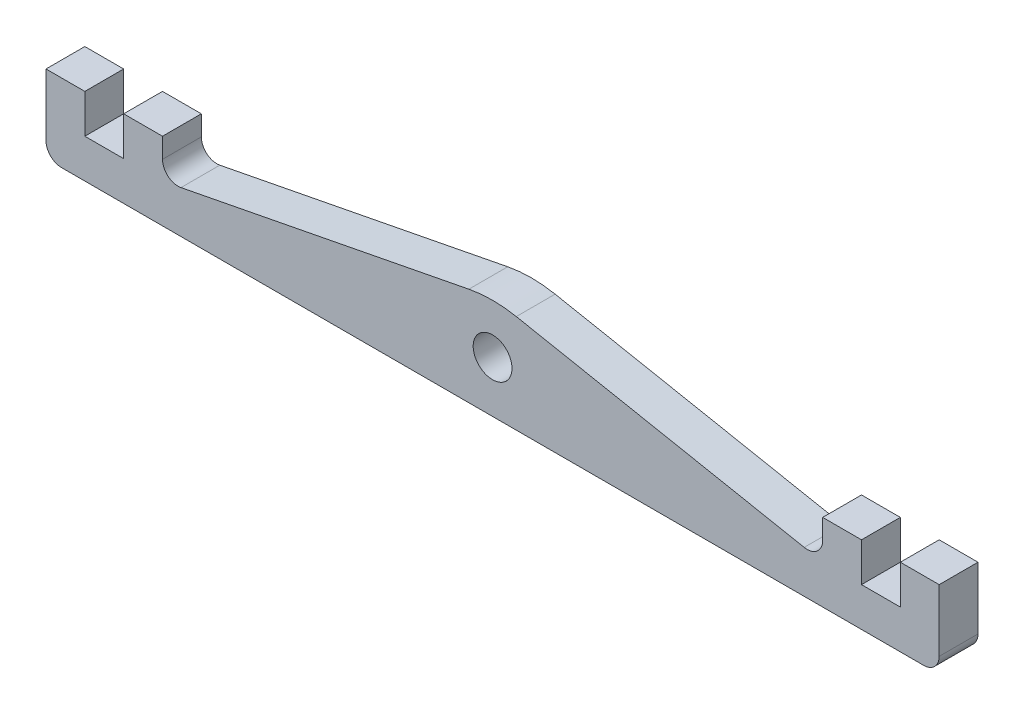
ISO-10303-21;
HEADER;
FILE_DESCRIPTION(('STEP AP214'),'2;1');
FILE_NAME('part.step','',(''),(''),'','','');
FILE_SCHEMA(('AUTOMOTIVE_DESIGN { 1 0 10303 214 1 1 1 1 }'));
ENDSEC;
DATA;
#1=APPLICATION_CONTEXT('core data for automotive mechanical design processes');
#2=APPLICATION_PROTOCOL_DEFINITION('international standard','automotive_design',2000,#1);
#3=PRODUCT_CONTEXT('',#1,'mechanical');
#4=PRODUCT('Part','Part','',(#3));
#5=PRODUCT_RELATED_PRODUCT_CATEGORY('part','',(#4));
#6=PRODUCT_DEFINITION_FORMATION('','',#4);
#7=PRODUCT_DEFINITION_CONTEXT('part definition',#1,'design');
#8=PRODUCT_DEFINITION('design','',#6,#7);
#9=PRODUCT_DEFINITION_SHAPE('','',#8);
#10=(LENGTH_UNIT() NAMED_UNIT(*) SI_UNIT(.MILLI.,.METRE.));
#11=(NAMED_UNIT(*) PLANE_ANGLE_UNIT() SI_UNIT($,.RADIAN.));
#12=(NAMED_UNIT(*) SI_UNIT($,.STERADIAN.) SOLID_ANGLE_UNIT());
#13=UNCERTAINTY_MEASURE_WITH_UNIT(LENGTH_MEASURE(1.E-05),#10,'distance_accuracy_value','');
#14=(GEOMETRIC_REPRESENTATION_CONTEXT(3) GLOBAL_UNCERTAINTY_ASSIGNED_CONTEXT((#13)) GLOBAL_UNIT_ASSIGNED_CONTEXT((#10,
#11,#12)) REPRESENTATION_CONTEXT('',''));
#15=CARTESIAN_POINT('',(0.,0.,0.));
#16=DIRECTION('',(0.,0.,1.));
#17=DIRECTION('',(1.,0.,0.));
#18=AXIS2_PLACEMENT_3D('',#15,#16,#17);
#19=CARTESIAN_POINT('',(70.485,5.08,6.35));
#20=DIRECTION('',(0.,0.,1.));
#21=DIRECTION('',(1.,0.,0.));
#22=AXIS2_PLACEMENT_3D('',#19,#20,#21);
#23=PLANE('',#22);
#24=CARTESIAN_POINT('',(70.485,5.08,6.35));
#25=DIRECTION('',(0.,0.,1.));
#26=DIRECTION('',(1.,0.,0.));
#27=AXIS2_PLACEMENT_3D('',#24,#25,#26);
#28=CIRCLE('',#27,2.54);
#29=CARTESIAN_POINT('',(70.485,2.54,6.35));
#30=VERTEX_POINT('',#29);
#31=CARTESIAN_POINT('',(73.025,5.08,6.35));
#32=VERTEX_POINT('',#31);
#33=EDGE_CURVE('E255',#30,#32,#28,.T.);
#34=ORIENTED_EDGE('',*,*,#33,.T.);
#35=DIRECTION('',(0.,1.,0.));
#36=VECTOR('',#35,1.);
#37=CARTESIAN_POINT('',(73.025,15.24,6.35));
#38=LINE('',#37,#36);
#39=CARTESIAN_POINT('',(73.025,15.24,6.35));
#40=VERTEX_POINT('',#39);
#41=EDGE_CURVE('E133',#32,#40,#38,.T.);
#42=ORIENTED_EDGE('',*,*,#41,.T.);
#43=DIRECTION('',(-1.,0.,0.));
#44=VECTOR('',#43,1.);
#45=CARTESIAN_POINT('',(66.675,15.24,6.35));
#46=LINE('',#45,#44);
#47=CARTESIAN_POINT('',(66.675,15.24,6.35));
#48=VERTEX_POINT('',#47);
#49=EDGE_CURVE('E312',#40,#48,#46,.T.);
#50=ORIENTED_EDGE('',*,*,#49,.T.);
#51=DIRECTION('',(0.,-1.,0.));
#52=VECTOR('',#51,1.);
#53=CARTESIAN_POINT('',(66.675,8.89,6.35));
#54=LINE('',#53,#52);
#55=CARTESIAN_POINT('',(66.675,8.89,6.35));
#56=VERTEX_POINT('',#55);
#57=EDGE_CURVE('E331',#48,#56,#54,.T.);
#58=ORIENTED_EDGE('',*,*,#57,.T.);
#59=DIRECTION('',(-1.,0.,0.));
#60=VECTOR('',#59,1.);
#61=CARTESIAN_POINT('',(60.325,8.89,6.35));
#62=LINE('',#61,#60);
#63=CARTESIAN_POINT('',(60.325,8.89,6.35));
#64=VERTEX_POINT('',#63);
#65=EDGE_CURVE('E328',#56,#64,#62,.T.);
#66=ORIENTED_EDGE('',*,*,#65,.T.);
#67=DIRECTION('',(0.,1.,0.));
#68=VECTOR('',#67,1.);
#69=CARTESIAN_POINT('',(60.325,15.24,6.35));
#70=LINE('',#69,#68);
#71=CARTESIAN_POINT('',(60.325,15.24,6.35));
#72=VERTEX_POINT('',#71);
#73=EDGE_CURVE('E330',#64,#72,#70,.T.);
#74=ORIENTED_EDGE('',*,*,#73,.T.);
#75=DIRECTION('',(-1.,0.,0.));
#76=VECTOR('',#75,1.);
#77=CARTESIAN_POINT('',(53.975,15.24,6.35));
#78=LINE('',#77,#76);
#79=CARTESIAN_POINT('',(53.975,15.24,6.35));
#80=VERTEX_POINT('',#79);
#81=EDGE_CURVE('E333',#72,#80,#78,.T.);
#82=ORIENTED_EDGE('',*,*,#81,.T.);
#83=DIRECTION('',(0.,-1.,0.));
#84=VECTOR('',#83,1.);
#85=CARTESIAN_POINT('',(53.975,11.971266390396,6.35));
#86=LINE('',#85,#84);
#87=CARTESIAN_POINT('',(53.975,11.971266390396,6.35));
#88=VERTEX_POINT('',#87);
#89=EDGE_CURVE('E339',#80,#88,#86,.T.);
#90=ORIENTED_EDGE('',*,*,#89,.T.);
#91=CARTESIAN_POINT('',(51.435,11.971266390396,6.35));
#92=DIRECTION('',(0.,0.,-1.));
#93=DIRECTION('',(1.,0.,0.));
#94=AXIS2_PLACEMENT_3D('',#91,#92,#93);
#95=CIRCLE('',#94,2.54);
#96=CARTESIAN_POINT('',(50.9503451517436,9.47793334443896,6.35));
#97=VERTEX_POINT('',#96);
#98=EDGE_CURVE('E341',#88,#97,#95,.T.);
#99=ORIENTED_EDGE('',*,*,#98,.T.);
#100=DIRECTION('',(-0.981627183447665,0.190808995376539,0.));
#101=VECTOR('',#100,1.);
#102=CARTESIAN_POINT('',(3.87723878605126,18.6280183118746,6.35));
#103=LINE('',#102,#101);
#104=CARTESIAN_POINT('',(3.87723878605126,18.6280183118746,6.35));
#105=VERTEX_POINT('',#104);
#106=EDGE_CURVE('E343',#97,#105,#103,.T.);
#107=ORIENTED_EDGE('',*,*,#106,.T.);
#108=CARTESIAN_POINT('',(0.,-1.31864605578194,6.35));
#109=DIRECTION('',(0.,0.,1.));
#110=DIRECTION('',(1.,0.,0.));
#111=AXIS2_PLACEMENT_3D('',#108,#109,#110);
#112=CIRCLE('',#111,20.32);
#113=CARTESIAN_POINT('',(-3.87723878605126,18.6280183118746,6.35));
#114=VERTEX_POINT('',#113);
#115=EDGE_CURVE('E345',#105,#114,#112,.T.);
#116=ORIENTED_EDGE('',*,*,#115,.T.);
#117=DIRECTION('',(-0.981627183447665,-0.190808995376539,0.));
#118=VECTOR('',#117,1.);
#119=CARTESIAN_POINT('',(-3.87723878605126,18.6280183118746,6.35));
#120=LINE('',#119,#118);
#121=CARTESIAN_POINT('',(-50.9503451517436,9.47793334443896,6.35));
#122=VERTEX_POINT('',#121);
#123=EDGE_CURVE('E347',#114,#122,#120,.T.);
#124=ORIENTED_EDGE('',*,*,#123,.T.);
#125=CARTESIAN_POINT('',(-51.435,11.971266390396,6.35));
#126=DIRECTION('',(0.,0.,-1.));
#127=DIRECTION('',(-1.,0.,0.));
#128=AXIS2_PLACEMENT_3D('',#125,#126,#127);
#129=CIRCLE('',#128,2.54);
#130=CARTESIAN_POINT('',(-53.975,11.971266390396,6.35));
#131=VERTEX_POINT('',#130);
#132=EDGE_CURVE('E349',#122,#131,#129,.T.);
#133=ORIENTED_EDGE('',*,*,#132,.T.);
#134=DIRECTION('',(0.,1.,0.));
#135=VECTOR('',#134,1.);
#136=CARTESIAN_POINT('',(-53.975,11.971266390396,6.35));
#137=LINE('',#136,#135);
#138=CARTESIAN_POINT('',(-53.975,15.24,6.35));
#139=VERTEX_POINT('',#138);
#140=EDGE_CURVE('E351',#131,#139,#137,.T.);
#141=ORIENTED_EDGE('',*,*,#140,.T.);
#142=DIRECTION('',(-1.,0.,0.));
#143=VECTOR('',#142,1.);
#144=CARTESIAN_POINT('',(-53.975,15.24,6.35));
#145=LINE('',#144,#143);
#146=CARTESIAN_POINT('',(-60.325,15.24,6.35));
#147=VERTEX_POINT('',#146);
#148=EDGE_CURVE('E353',#139,#147,#145,.T.);
#149=ORIENTED_EDGE('',*,*,#148,.T.);
#150=DIRECTION('',(0.,-1.,0.));
#151=VECTOR('',#150,1.);
#152=CARTESIAN_POINT('',(-60.325,15.24,6.35));
#153=LINE('',#152,#151);
#154=CARTESIAN_POINT('',(-60.325,8.89,6.35));
#155=VERTEX_POINT('',#154);
#156=EDGE_CURVE('E355',#147,#155,#153,.T.);
#157=ORIENTED_EDGE('',*,*,#156,.T.);
#158=DIRECTION('',(-1.,0.,0.));
#159=VECTOR('',#158,1.);
#160=CARTESIAN_POINT('',(-60.325,8.89,6.35));
#161=LINE('',#160,#159);
#162=CARTESIAN_POINT('',(-66.675,8.89,6.35));
#163=VERTEX_POINT('',#162);
#164=EDGE_CURVE('E357',#155,#163,#161,.T.);
#165=ORIENTED_EDGE('',*,*,#164,.T.);
#166=DIRECTION('',(0.,1.,0.));
#167=VECTOR('',#166,1.);
#168=CARTESIAN_POINT('',(-66.675,8.89,6.35));
#169=LINE('',#168,#167);
#170=CARTESIAN_POINT('',(-66.675,15.24,6.35));
#171=VERTEX_POINT('',#170);
#172=EDGE_CURVE('E359',#163,#171,#169,.T.);
#173=ORIENTED_EDGE('',*,*,#172,.T.);
#174=DIRECTION('',(-1.,0.,0.));
#175=VECTOR('',#174,1.);
#176=CARTESIAN_POINT('',(-66.675,15.24,6.35));
#177=LINE('',#176,#175);
#178=CARTESIAN_POINT('',(-73.025,15.24,6.35));
#179=VERTEX_POINT('',#178);
#180=EDGE_CURVE('E194',#171,#179,#177,.T.);
#181=ORIENTED_EDGE('',*,*,#180,.T.);
#182=DIRECTION('',(0.,-1.,0.));
#183=VECTOR('',#182,1.);
#184=CARTESIAN_POINT('',(-73.025,15.24,6.35));
#185=LINE('',#184,#183);
#186=CARTESIAN_POINT('',(-73.025,5.08,6.35));
#187=VERTEX_POINT('',#186);
#188=EDGE_CURVE('E188',#179,#187,#185,.T.);
#189=ORIENTED_EDGE('',*,*,#188,.T.);
#190=CARTESIAN_POINT('',(-70.485,5.08,6.35));
#191=DIRECTION('',(0.,0.,1.));
#192=DIRECTION('',(-1.,0.,0.));
#193=AXIS2_PLACEMENT_3D('',#190,#191,#192);
#194=CIRCLE('',#193,2.54);
#195=CARTESIAN_POINT('',(-70.485,2.54,6.35));
#196=VERTEX_POINT('',#195);
#197=EDGE_CURVE('E192',#187,#196,#194,.T.);
#198=ORIENTED_EDGE('',*,*,#197,.T.);
#199=DIRECTION('',(1.,0.,0.));
#200=VECTOR('',#199,1.);
#201=CARTESIAN_POINT('',(-70.485,2.54,6.35));
#202=LINE('',#201,#200);
#203=EDGE_CURVE('E48',#196,#30,#202,.T.);
#204=ORIENTED_EDGE('',*,*,#203,.T.);
#205=EDGE_LOOP('',(#34,#42,#50,#58,#66,#74,#82,#90,#99,#107,#116,#124,#133,#141,#149,#157,#165,
#173,#181,#189,#198,#204));
#206=FACE_BOUND('',#205,.T.);
#207=CARTESIAN_POINT('',(0.,10.922,6.35));
#208=DIRECTION('',(0.,0.,1.));
#209=DIRECTION('',(1.,0.,0.));
#210=AXIS2_PLACEMENT_3D('',#207,#208,#209);
#211=CIRCLE('',#210,3.175);
#212=CARTESIAN_POINT('',(3.175,10.922,6.35));
#213=VERTEX_POINT('',#212);
#214=EDGE_CURVE('E216',#213,#213,#211,.T.);
#215=ORIENTED_EDGE('',*,*,#214,.F.);
#216=EDGE_LOOP('',(#215));
#217=FACE_BOUND('',#216,.T.);
#218=ADVANCED_FACE('F31',(#206,#217),#23,.T.);
#219=CARTESIAN_POINT('',(70.485,5.08,0.));
#220=DIRECTION('',(0.,0.,1.));
#221=DIRECTION('',(1.,0.,0.));
#222=AXIS2_PLACEMENT_3D('',#219,#220,#221);
#223=PLANE('',#222);
#224=CARTESIAN_POINT('',(70.485,5.08,0.));
#225=DIRECTION('',(0.,0.,1.));
#226=DIRECTION('',(1.,0.,0.));
#227=AXIS2_PLACEMENT_3D('',#224,#225,#226);
#228=CIRCLE('',#227,2.54);
#229=CARTESIAN_POINT('',(70.485,2.54,0.));
#230=VERTEX_POINT('',#229);
#231=CARTESIAN_POINT('',(73.025,5.08,0.));
#232=VERTEX_POINT('',#231);
#233=EDGE_CURVE('E212',#230,#232,#228,.T.);
#234=ORIENTED_EDGE('',*,*,#233,.F.);
#235=DIRECTION('',(1.,0.,0.));
#236=VECTOR('',#235,1.);
#237=CARTESIAN_POINT('',(-70.485,2.54,0.));
#238=LINE('',#237,#236);
#239=CARTESIAN_POINT('',(-70.485,2.54,0.));
#240=VERTEX_POINT('',#239);
#241=EDGE_CURVE('E125',#240,#230,#238,.T.);
#242=ORIENTED_EDGE('',*,*,#241,.F.);
#243=CARTESIAN_POINT('',(-70.485,5.08,0.));
#244=DIRECTION('',(0.,0.,1.));
#245=DIRECTION('',(-1.,0.,0.));
#246=AXIS2_PLACEMENT_3D('',#243,#244,#245);
#247=CIRCLE('',#246,2.54);
#248=CARTESIAN_POINT('',(-73.025,5.08,0.));
#249=VERTEX_POINT('',#248);
#250=EDGE_CURVE('E119',#249,#240,#247,.T.);
#251=ORIENTED_EDGE('',*,*,#250,.F.);
#252=DIRECTION('',(0.,-1.,0.));
#253=VECTOR('',#252,1.);
#254=CARTESIAN_POINT('',(-73.025,15.24,0.));
#255=LINE('',#254,#253);
#256=CARTESIAN_POINT('',(-73.025,15.24,0.));
#257=VERTEX_POINT('',#256);
#258=EDGE_CURVE('E202',#257,#249,#255,.T.);
#259=ORIENTED_EDGE('',*,*,#258,.F.);
#260=DIRECTION('',(-1.,0.,0.));
#261=VECTOR('',#260,1.);
#262=CARTESIAN_POINT('',(-66.675,15.24,0.));
#263=LINE('',#262,#261);
#264=CARTESIAN_POINT('',(-66.675,15.24,0.));
#265=VERTEX_POINT('',#264);
#266=EDGE_CURVE('E250',#265,#257,#263,.T.);
#267=ORIENTED_EDGE('',*,*,#266,.F.);
#268=DIRECTION('',(0.,1.,0.));
#269=VECTOR('',#268,1.);
#270=CARTESIAN_POINT('',(-66.675,8.89,0.));
#271=LINE('',#270,#269);
#272=CARTESIAN_POINT('',(-66.675,8.89,0.));
#273=VERTEX_POINT('',#272);
#274=EDGE_CURVE('E248',#273,#265,#271,.T.);
#275=ORIENTED_EDGE('',*,*,#274,.F.);
#276=DIRECTION('',(-1.,0.,0.));
#277=VECTOR('',#276,1.);
#278=CARTESIAN_POINT('',(-60.325,8.89,0.));
#279=LINE('',#278,#277);
#280=CARTESIAN_POINT('',(-60.325,8.89,0.));
#281=VERTEX_POINT('',#280);
#282=EDGE_CURVE('E246',#281,#273,#279,.T.);
#283=ORIENTED_EDGE('',*,*,#282,.F.);
#284=DIRECTION('',(0.,-1.,0.));
#285=VECTOR('',#284,1.);
#286=CARTESIAN_POINT('',(-60.325,15.24,0.));
#287=LINE('',#286,#285);
#288=CARTESIAN_POINT('',(-60.325,15.24,0.));
#289=VERTEX_POINT('',#288);
#290=EDGE_CURVE('E244',#289,#281,#287,.T.);
#291=ORIENTED_EDGE('',*,*,#290,.F.);
#292=DIRECTION('',(-1.,0.,0.));
#293=VECTOR('',#292,1.);
#294=CARTESIAN_POINT('',(-53.975,15.24,0.));
#295=LINE('',#294,#293);
#296=CARTESIAN_POINT('',(-53.975,15.24,0.));
#297=VERTEX_POINT('',#296);
#298=EDGE_CURVE('E242',#297,#289,#295,.T.);
#299=ORIENTED_EDGE('',*,*,#298,.F.);
#300=DIRECTION('',(0.,1.,0.));
#301=VECTOR('',#300,1.);
#302=CARTESIAN_POINT('',(-53.975,11.971266390396,0.));
#303=LINE('',#302,#301);
#304=CARTESIAN_POINT('',(-53.975,11.971266390396,0.));
#305=VERTEX_POINT('',#304);
#306=EDGE_CURVE('E240',#305,#297,#303,.T.);
#307=ORIENTED_EDGE('',*,*,#306,.F.);
#308=CARTESIAN_POINT('',(-51.435,11.971266390396,0.));
#309=DIRECTION('',(0.,0.,-1.));
#310=DIRECTION('',(-1.,0.,0.));
#311=AXIS2_PLACEMENT_3D('',#308,#309,#310);
#312=CIRCLE('',#311,2.54);
#313=CARTESIAN_POINT('',(-50.9503451517436,9.47793334443896,0.));
#314=VERTEX_POINT('',#313);
#315=EDGE_CURVE('E238',#314,#305,#312,.T.);
#316=ORIENTED_EDGE('',*,*,#315,.F.);
#317=DIRECTION('',(-0.981627183447665,-0.190808995376539,0.));
#318=VECTOR('',#317,1.);
#319=CARTESIAN_POINT('',(-3.87723878605126,18.6280183118746,0.));
#320=LINE('',#319,#318);
#321=CARTESIAN_POINT('',(-3.87723878605126,18.6280183118746,0.));
#322=VERTEX_POINT('',#321);
#323=EDGE_CURVE('E236',#322,#314,#320,.T.);
#324=ORIENTED_EDGE('',*,*,#323,.F.);
#325=CARTESIAN_POINT('',(0.,-1.31864605578194,0.));
#326=DIRECTION('',(0.,0.,1.));
#327=DIRECTION('',(1.,0.,0.));
#328=AXIS2_PLACEMENT_3D('',#325,#326,#327);
#329=CIRCLE('',#328,20.32);
#330=CARTESIAN_POINT('',(3.87723878605126,18.6280183118746,0.));
#331=VERTEX_POINT('',#330);
#332=EDGE_CURVE('E234',#331,#322,#329,.T.);
#333=ORIENTED_EDGE('',*,*,#332,.F.);
#334=DIRECTION('',(-0.981627183447665,0.190808995376539,0.));
#335=VECTOR('',#334,1.);
#336=CARTESIAN_POINT('',(3.87723878605126,18.6280183118746,0.));
#337=LINE('',#336,#335);
#338=CARTESIAN_POINT('',(50.9503451517436,9.47793334443896,0.));
#339=VERTEX_POINT('',#338);
#340=EDGE_CURVE('E232',#339,#331,#337,.T.);
#341=ORIENTED_EDGE('',*,*,#340,.F.);
#342=CARTESIAN_POINT('',(51.435,11.971266390396,0.));
#343=DIRECTION('',(0.,0.,-1.));
#344=DIRECTION('',(1.,0.,0.));
#345=AXIS2_PLACEMENT_3D('',#342,#343,#344);
#346=CIRCLE('',#345,2.54);
#347=CARTESIAN_POINT('',(53.975,11.971266390396,0.));
#348=VERTEX_POINT('',#347);
#349=EDGE_CURVE('E230',#348,#339,#346,.T.);
#350=ORIENTED_EDGE('',*,*,#349,.F.);
#351=DIRECTION('',(0.,-1.,0.));
#352=VECTOR('',#351,1.);
#353=CARTESIAN_POINT('',(53.975,11.971266390396,0.));
#354=LINE('',#353,#352);
#355=CARTESIAN_POINT('',(53.975,15.24,0.));
#356=VERTEX_POINT('',#355);
#357=EDGE_CURVE('E228',#356,#348,#354,.T.);
#358=ORIENTED_EDGE('',*,*,#357,.F.);
#359=DIRECTION('',(-1.,0.,0.));
#360=VECTOR('',#359,1.);
#361=CARTESIAN_POINT('',(53.975,15.24,0.));
#362=LINE('',#361,#360);
#363=CARTESIAN_POINT('',(60.325,15.24,0.));
#364=VERTEX_POINT('',#363);
#365=EDGE_CURVE('E226',#364,#356,#362,.T.);
#366=ORIENTED_EDGE('',*,*,#365,.F.);
#367=DIRECTION('',(0.,1.,0.));
#368=VECTOR('',#367,1.);
#369=CARTESIAN_POINT('',(60.325,15.24,0.));
#370=LINE('',#369,#368);
#371=CARTESIAN_POINT('',(60.325,8.89,0.));
#372=VERTEX_POINT('',#371);
#373=EDGE_CURVE('E224',#372,#364,#370,.T.);
#374=ORIENTED_EDGE('',*,*,#373,.F.);
#375=DIRECTION('',(-1.,0.,0.));
#376=VECTOR('',#375,1.);
#377=CARTESIAN_POINT('',(60.325,8.89,0.));
#378=LINE('',#377,#376);
#379=CARTESIAN_POINT('',(66.675,8.89,0.));
#380=VERTEX_POINT('',#379);
#381=EDGE_CURVE('E222',#380,#372,#378,.T.);
#382=ORIENTED_EDGE('',*,*,#381,.F.);
#383=DIRECTION('',(0.,-1.,0.));
#384=VECTOR('',#383,1.);
#385=CARTESIAN_POINT('',(66.675,8.89,0.));
#386=LINE('',#385,#384);
#387=CARTESIAN_POINT('',(66.675,15.24,0.));
#388=VERTEX_POINT('',#387);
#389=EDGE_CURVE('E220',#388,#380,#386,.T.);
#390=ORIENTED_EDGE('',*,*,#389,.F.);
#391=DIRECTION('',(-1.,0.,0.));
#392=VECTOR('',#391,1.);
#393=CARTESIAN_POINT('',(66.675,15.24,0.));
#394=LINE('',#393,#392);
#395=CARTESIAN_POINT('',(73.025,15.24,0.));
#396=VERTEX_POINT('',#395);
#397=EDGE_CURVE('E218',#396,#388,#394,.T.);
#398=ORIENTED_EDGE('',*,*,#397,.F.);
#399=DIRECTION('',(0.,1.,0.));
#400=VECTOR('',#399,1.);
#401=CARTESIAN_POINT('',(73.025,15.24,0.));
#402=LINE('',#401,#400);
#403=EDGE_CURVE('E215',#232,#396,#402,.T.);
#404=ORIENTED_EDGE('',*,*,#403,.F.);
#405=EDGE_LOOP('',(#234,#242,#251,#259,#267,#275,#283,#291,#299,#307,#316,#324,#333,#341,#350,
#358,#366,#374,#382,#390,#398,#404));
#406=FACE_BOUND('',#405,.T.);
#407=CARTESIAN_POINT('',(0.,10.922,0.));
#408=DIRECTION('',(0.,0.,1.));
#409=DIRECTION('',(1.,0.,0.));
#410=AXIS2_PLACEMENT_3D('',#407,#408,#409);
#411=CIRCLE('',#410,3.175);
#412=CARTESIAN_POINT('',(3.175,10.922,0.));
#413=VERTEX_POINT('',#412);
#414=EDGE_CURVE('E636',#413,#413,#411,.T.);
#415=ORIENTED_EDGE('',*,*,#414,.T.);
#416=EDGE_LOOP('',(#415));
#417=FACE_BOUND('',#416,.T.);
#418=ADVANCED_FACE('F316',(#406,#417),#223,.F.);
#419=CARTESIAN_POINT('',(70.485,5.08,6.35));
#420=DIRECTION('',(0.,0.,-1.));
#421=DIRECTION('',(-1.,0.,0.));
#422=AXIS2_PLACEMENT_3D('',#419,#420,#421);
#423=CYLINDRICAL_SURFACE('',#422,2.54);
#424=ORIENTED_EDGE('',*,*,#233,.T.);
#425=DIRECTION('',(0.,0.,-1.));
#426=VECTOR('',#425,1.);
#427=CARTESIAN_POINT('',(73.025,5.08,6.35));
#428=LINE('',#427,#426);
#429=EDGE_CURVE('E11',#32,#232,#428,.T.);
#430=ORIENTED_EDGE('',*,*,#429,.F.);
#431=ORIENTED_EDGE('',*,*,#33,.F.);
#432=DIRECTION('',(0.,0.,-1.));
#433=VECTOR('',#432,1.);
#434=CARTESIAN_POINT('',(70.485,2.54,6.35));
#435=LINE('',#434,#433);
#436=EDGE_CURVE('E208',#30,#230,#435,.T.);
#437=ORIENTED_EDGE('',*,*,#436,.T.);
#438=EDGE_LOOP('',(#424,#430,#431,#437));
#439=FACE_BOUND('',#438,.T.);
#440=ADVANCED_FACE('F33',(#439),#423,.T.);
#441=CARTESIAN_POINT('',(73.025,15.24,6.35));
#442=DIRECTION('',(-1.,0.,0.));
#443=DIRECTION('',(0.,0.,1.));
#444=AXIS2_PLACEMENT_3D('',#441,#442,#443);
#445=PLANE('',#444);
#446=ORIENTED_EDGE('',*,*,#403,.T.);
#447=DIRECTION('',(0.,0.,-1.));
#448=VECTOR('',#447,1.);
#449=CARTESIAN_POINT('',(73.025,15.24,6.35));
#450=LINE('',#449,#448);
#451=EDGE_CURVE('E40',#40,#396,#450,.T.);
#452=ORIENTED_EDGE('',*,*,#451,.F.);
#453=ORIENTED_EDGE('',*,*,#41,.F.);
#454=ORIENTED_EDGE('',*,*,#429,.T.);
#455=EDGE_LOOP('',(#446,#452,#453,#454));
#456=FACE_BOUND('',#455,.T.);
#457=ADVANCED_FACE('F393',(#456),#445,.F.);
#458=CARTESIAN_POINT('',(66.675,15.24,6.35));
#459=DIRECTION('',(0.,-1.,0.));
#460=DIRECTION('',(1.,0.,0.));
#461=AXIS2_PLACEMENT_3D('',#458,#459,#460);
#462=PLANE('',#461);
#463=ORIENTED_EDGE('',*,*,#397,.T.);
#464=DIRECTION('',(0.,0.,-1.));
#465=VECTOR('',#464,1.);
#466=CARTESIAN_POINT('',(66.675,15.24,6.35));
#467=LINE('',#466,#465);
#468=EDGE_CURVE('E304',#48,#388,#467,.T.);
#469=ORIENTED_EDGE('',*,*,#468,.F.);
#470=ORIENTED_EDGE('',*,*,#49,.F.);
#471=ORIENTED_EDGE('',*,*,#451,.T.);
#472=EDGE_LOOP('',(#463,#469,#470,#471));
#473=FACE_BOUND('',#472,.T.);
#474=ADVANCED_FACE('F310',(#473),#462,.F.);
#475=CARTESIAN_POINT('',(66.675,8.89,6.35));
#476=DIRECTION('',(1.,0.,0.));
#477=DIRECTION('',(0.,0.,-1.));
#478=AXIS2_PLACEMENT_3D('',#475,#476,#477);
#479=PLANE('',#478);
#480=ORIENTED_EDGE('',*,*,#389,.T.);
#481=DIRECTION('',(0.,0.,-1.));
#482=VECTOR('',#481,1.);
#483=CARTESIAN_POINT('',(66.675,8.89,6.35));
#484=LINE('',#483,#482);
#485=EDGE_CURVE('E301',#56,#380,#484,.T.);
#486=ORIENTED_EDGE('',*,*,#485,.F.);
#487=ORIENTED_EDGE('',*,*,#57,.F.);
#488=ORIENTED_EDGE('',*,*,#468,.T.);
#489=EDGE_LOOP('',(#480,#486,#487,#488));
#490=FACE_BOUND('',#489,.T.);
#491=ADVANCED_FACE('F322',(#490),#479,.F.);
#492=CARTESIAN_POINT('',(60.325,8.89,6.35));
#493=DIRECTION('',(0.,-1.,0.));
#494=DIRECTION('',(0.,0.,-1.));
#495=AXIS2_PLACEMENT_3D('',#492,#493,#494);
#496=PLANE('',#495);
#497=ORIENTED_EDGE('',*,*,#381,.T.);
#498=DIRECTION('',(0.,0.,-1.));
#499=VECTOR('',#498,1.);
#500=CARTESIAN_POINT('',(60.325,8.89,6.35));
#501=LINE('',#500,#499);
#502=EDGE_CURVE('E298',#64,#372,#501,.T.);
#503=ORIENTED_EDGE('',*,*,#502,.F.);
#504=ORIENTED_EDGE('',*,*,#65,.F.);
#505=ORIENTED_EDGE('',*,*,#485,.T.);
#506=EDGE_LOOP('',(#497,#503,#504,#505));
#507=FACE_BOUND('',#506,.T.);
#508=ADVANCED_FACE('F326',(#507),#496,.F.);
#509=CARTESIAN_POINT('',(60.325,15.24,6.35));
#510=DIRECTION('',(-1.,0.,0.));
#511=DIRECTION('',(0.,0.,1.));
#512=AXIS2_PLACEMENT_3D('',#509,#510,#511);
#513=PLANE('',#512);
#514=ORIENTED_EDGE('',*,*,#373,.T.);
#515=DIRECTION('',(0.,0.,-1.));
#516=VECTOR('',#515,1.);
#517=CARTESIAN_POINT('',(60.325,15.24,6.35));
#518=LINE('',#517,#516);
#519=EDGE_CURVE('E295',#72,#364,#518,.T.);
#520=ORIENTED_EDGE('',*,*,#519,.F.);
#521=ORIENTED_EDGE('',*,*,#73,.F.);
#522=ORIENTED_EDGE('',*,*,#502,.T.);
#523=EDGE_LOOP('',(#514,#520,#521,#522));
#524=FACE_BOUND('',#523,.T.);
#525=ADVANCED_FACE('F406',(#524),#513,.F.);
#526=CARTESIAN_POINT('',(53.975,15.24,6.35));
#527=DIRECTION('',(0.,-1.,0.));
#528=DIRECTION('',(1.,0.,0.));
#529=AXIS2_PLACEMENT_3D('',#526,#527,#528);
#530=PLANE('',#529);
#531=ORIENTED_EDGE('',*,*,#365,.T.);
#532=DIRECTION('',(0.,0.,-1.));
#533=VECTOR('',#532,1.);
#534=CARTESIAN_POINT('',(53.975,15.24,6.35));
#535=LINE('',#534,#533);
#536=EDGE_CURVE('E292',#80,#356,#535,.T.);
#537=ORIENTED_EDGE('',*,*,#536,.F.);
#538=ORIENTED_EDGE('',*,*,#81,.F.);
#539=ORIENTED_EDGE('',*,*,#519,.T.);
#540=EDGE_LOOP('',(#531,#537,#538,#539));
#541=FACE_BOUND('',#540,.T.);
#542=ADVANCED_FACE('F409',(#541),#530,.F.);
#543=CARTESIAN_POINT('',(53.975,11.971266390396,6.35));
#544=DIRECTION('',(1.,0.,0.));
#545=DIRECTION('',(0.,0.,-1.));
#546=AXIS2_PLACEMENT_3D('',#543,#544,#545);
#547=PLANE('',#546);
#548=ORIENTED_EDGE('',*,*,#357,.T.);
#549=DIRECTION('',(0.,0.,-1.));
#550=VECTOR('',#549,1.);
#551=CARTESIAN_POINT('',(53.975,11.971266390396,6.35));
#552=LINE('',#551,#550);
#553=EDGE_CURVE('E289',#88,#348,#552,.T.);
#554=ORIENTED_EDGE('',*,*,#553,.F.);
#555=ORIENTED_EDGE('',*,*,#89,.F.);
#556=ORIENTED_EDGE('',*,*,#536,.T.);
#557=EDGE_LOOP('',(#548,#554,#555,#556));
#558=FACE_BOUND('',#557,.T.);
#559=ADVANCED_FACE('F413',(#558),#547,.F.);
#560=CARTESIAN_POINT('',(51.435,11.971266390396,6.35));
#561=DIRECTION('',(0.,0.,-1.));
#562=DIRECTION('',(-1.,0.,0.));
#563=AXIS2_PLACEMENT_3D('',#560,#561,#562);
#564=CYLINDRICAL_SURFACE('',#563,2.54);
#565=ORIENTED_EDGE('',*,*,#349,.T.);
#566=DIRECTION('',(0.,0.,-1.));
#567=VECTOR('',#566,1.);
#568=CARTESIAN_POINT('',(50.9503451517436,9.47793334443896,6.35));
#569=LINE('',#568,#567);
#570=EDGE_CURVE('E286',#97,#339,#569,.T.);
#571=ORIENTED_EDGE('',*,*,#570,.F.);
#572=ORIENTED_EDGE('',*,*,#98,.F.);
#573=ORIENTED_EDGE('',*,*,#553,.T.);
#574=EDGE_LOOP('',(#565,#571,#572,#573));
#575=FACE_BOUND('',#574,.T.);
#576=ADVANCED_FACE('F417',(#575),#564,.F.);
#577=CARTESIAN_POINT('',(3.87723878605126,18.6280183118746,6.35));
#578=DIRECTION('',(-0.190808995376539,-0.981627183447665,0.));
#579=DIRECTION('',(0.981627183447665,-0.190808995376539,0.));
#580=AXIS2_PLACEMENT_3D('',#577,#578,#579);
#581=PLANE('',#580);
#582=ORIENTED_EDGE('',*,*,#340,.T.);
#583=DIRECTION('',(0.,0.,-1.));
#584=VECTOR('',#583,1.);
#585=CARTESIAN_POINT('',(3.87723878605126,18.6280183118746,6.35));
#586=LINE('',#585,#584);
#587=EDGE_CURVE('E283',#105,#331,#586,.T.);
#588=ORIENTED_EDGE('',*,*,#587,.F.);
#589=ORIENTED_EDGE('',*,*,#106,.F.);
#590=ORIENTED_EDGE('',*,*,#570,.T.);
#591=EDGE_LOOP('',(#582,#588,#589,#590));
#592=FACE_BOUND('',#591,.T.);
#593=ADVANCED_FACE('F421',(#592),#581,.F.);
#594=CARTESIAN_POINT('',(0.,-1.31864605578194,6.35));
#595=DIRECTION('',(0.,0.,-1.));
#596=DIRECTION('',(-1.,0.,0.));
#597=AXIS2_PLACEMENT_3D('',#594,#595,#596);
#598=CYLINDRICAL_SURFACE('',#597,20.32);
#599=ORIENTED_EDGE('',*,*,#332,.T.);
#600=DIRECTION('',(0.,0.,-1.));
#601=VECTOR('',#600,1.);
#602=CARTESIAN_POINT('',(-3.87723878605126,18.6280183118746,6.35));
#603=LINE('',#602,#601);
#604=EDGE_CURVE('E280',#114,#322,#603,.T.);
#605=ORIENTED_EDGE('',*,*,#604,.F.);
#606=ORIENTED_EDGE('',*,*,#115,.F.);
#607=ORIENTED_EDGE('',*,*,#587,.T.);
#608=EDGE_LOOP('',(#599,#605,#606,#607));
#609=FACE_BOUND('',#608,.T.);
#610=ADVANCED_FACE('F425',(#609),#598,.T.);
#611=CARTESIAN_POINT('',(-3.87723878605126,18.6280183118746,6.35));
#612=DIRECTION('',(0.190808995376539,-0.981627183447665,0.));
#613=DIRECTION('',(0.981627183447665,0.190808995376539,0.));
#614=AXIS2_PLACEMENT_3D('',#611,#612,#613);
#615=PLANE('',#614);
#616=ORIENTED_EDGE('',*,*,#323,.T.);
#617=DIRECTION('',(0.,0.,-1.));
#618=VECTOR('',#617,1.);
#619=CARTESIAN_POINT('',(-50.9503451517436,9.47793334443896,6.35));
#620=LINE('',#619,#618);
#621=EDGE_CURVE('E277',#122,#314,#620,.T.);
#622=ORIENTED_EDGE('',*,*,#621,.F.);
#623=ORIENTED_EDGE('',*,*,#123,.F.);
#624=ORIENTED_EDGE('',*,*,#604,.T.);
#625=EDGE_LOOP('',(#616,#622,#623,#624));
#626=FACE_BOUND('',#625,.T.);
#627=ADVANCED_FACE('F429',(#626),#615,.F.);
#628=CARTESIAN_POINT('',(-51.435,11.971266390396,6.35));
#629=DIRECTION('',(0.,0.,-1.));
#630=DIRECTION('',(-1.,0.,0.));
#631=AXIS2_PLACEMENT_3D('',#628,#629,#630);
#632=CYLINDRICAL_SURFACE('',#631,2.54);
#633=ORIENTED_EDGE('',*,*,#315,.T.);
#634=DIRECTION('',(0.,0.,-1.));
#635=VECTOR('',#634,1.);
#636=CARTESIAN_POINT('',(-53.975,11.971266390396,6.35));
#637=LINE('',#636,#635);
#638=EDGE_CURVE('E274',#131,#305,#637,.T.);
#639=ORIENTED_EDGE('',*,*,#638,.F.);
#640=ORIENTED_EDGE('',*,*,#132,.F.);
#641=ORIENTED_EDGE('',*,*,#621,.T.);
#642=EDGE_LOOP('',(#633,#639,#640,#641));
#643=FACE_BOUND('',#642,.T.);
#644=ADVANCED_FACE('F433',(#643),#632,.F.);
#645=CARTESIAN_POINT('',(-53.975,11.971266390396,6.35));
#646=DIRECTION('',(-1.,0.,0.));
#647=DIRECTION('',(0.,0.,1.));
#648=AXIS2_PLACEMENT_3D('',#645,#646,#647);
#649=PLANE('',#648);
#650=ORIENTED_EDGE('',*,*,#306,.T.);
#651=DIRECTION('',(0.,0.,-1.));
#652=VECTOR('',#651,1.);
#653=CARTESIAN_POINT('',(-53.975,15.24,6.35));
#654=LINE('',#653,#652);
#655=EDGE_CURVE('E271',#139,#297,#654,.T.);
#656=ORIENTED_EDGE('',*,*,#655,.F.);
#657=ORIENTED_EDGE('',*,*,#140,.F.);
#658=ORIENTED_EDGE('',*,*,#638,.T.);
#659=EDGE_LOOP('',(#650,#656,#657,#658));
#660=FACE_BOUND('',#659,.T.);
#661=ADVANCED_FACE('F437',(#660),#649,.F.);
#662=CARTESIAN_POINT('',(-53.975,15.24,6.35));
#663=DIRECTION('',(0.,-1.,0.));
#664=DIRECTION('',(1.,0.,0.));
#665=AXIS2_PLACEMENT_3D('',#662,#663,#664);
#666=PLANE('',#665);
#667=ORIENTED_EDGE('',*,*,#298,.T.);
#668=DIRECTION('',(0.,0.,-1.));
#669=VECTOR('',#668,1.);
#670=CARTESIAN_POINT('',(-60.325,15.24,6.35));
#671=LINE('',#670,#669);
#672=EDGE_CURVE('E268',#147,#289,#671,.T.);
#673=ORIENTED_EDGE('',*,*,#672,.F.);
#674=ORIENTED_EDGE('',*,*,#148,.F.);
#675=ORIENTED_EDGE('',*,*,#655,.T.);
#676=EDGE_LOOP('',(#667,#673,#674,#675));
#677=FACE_BOUND('',#676,.T.);
#678=ADVANCED_FACE('F441',(#677),#666,.F.);
#679=CARTESIAN_POINT('',(-60.325,15.24,6.35));
#680=DIRECTION('',(1.,0.,0.));
#681=DIRECTION('',(0.,0.,-1.));
#682=AXIS2_PLACEMENT_3D('',#679,#680,#681);
#683=PLANE('',#682);
#684=ORIENTED_EDGE('',*,*,#290,.T.);
#685=DIRECTION('',(0.,0.,-1.));
#686=VECTOR('',#685,1.);
#687=CARTESIAN_POINT('',(-60.325,8.89,6.35));
#688=LINE('',#687,#686);
#689=EDGE_CURVE('E265',#155,#281,#688,.T.);
#690=ORIENTED_EDGE('',*,*,#689,.F.);
#691=ORIENTED_EDGE('',*,*,#156,.F.);
#692=ORIENTED_EDGE('',*,*,#672,.T.);
#693=EDGE_LOOP('',(#684,#690,#691,#692));
#694=FACE_BOUND('',#693,.T.);
#695=ADVANCED_FACE('F445',(#694),#683,.F.);
#696=CARTESIAN_POINT('',(-60.325,8.89,6.35));
#697=DIRECTION('',(0.,-1.,0.));
#698=DIRECTION('',(0.,0.,-1.));
#699=AXIS2_PLACEMENT_3D('',#696,#697,#698);
#700=PLANE('',#699);
#701=ORIENTED_EDGE('',*,*,#282,.T.);
#702=DIRECTION('',(0.,0.,-1.));
#703=VECTOR('',#702,1.);
#704=CARTESIAN_POINT('',(-66.675,8.89,6.35));
#705=LINE('',#704,#703);
#706=EDGE_CURVE('E262',#163,#273,#705,.T.);
#707=ORIENTED_EDGE('',*,*,#706,.F.);
#708=ORIENTED_EDGE('',*,*,#164,.F.);
#709=ORIENTED_EDGE('',*,*,#689,.T.);
#710=EDGE_LOOP('',(#701,#707,#708,#709));
#711=FACE_BOUND('',#710,.T.);
#712=ADVANCED_FACE('F449',(#711),#700,.F.);
#713=CARTESIAN_POINT('',(-66.675,8.89,6.35));
#714=DIRECTION('',(-1.,0.,0.));
#715=DIRECTION('',(0.,0.,1.));
#716=AXIS2_PLACEMENT_3D('',#713,#714,#715);
#717=PLANE('',#716);
#718=ORIENTED_EDGE('',*,*,#274,.T.);
#719=DIRECTION('',(0.,0.,-1.));
#720=VECTOR('',#719,1.);
#721=CARTESIAN_POINT('',(-66.675,15.24,6.35));
#722=LINE('',#721,#720);
#723=EDGE_CURVE('E259',#171,#265,#722,.T.);
#724=ORIENTED_EDGE('',*,*,#723,.F.);
#725=ORIENTED_EDGE('',*,*,#172,.F.);
#726=ORIENTED_EDGE('',*,*,#706,.T.);
#727=EDGE_LOOP('',(#718,#724,#725,#726));
#728=FACE_BOUND('',#727,.T.);
#729=ADVANCED_FACE('F365',(#728),#717,.F.);
#730=CARTESIAN_POINT('',(-66.675,15.24,6.35));
#731=DIRECTION('',(0.,-1.,0.));
#732=DIRECTION('',(1.,0.,0.));
#733=AXIS2_PLACEMENT_3D('',#730,#731,#732);
#734=PLANE('',#733);
#735=ORIENTED_EDGE('',*,*,#266,.T.);
#736=DIRECTION('',(0.,0.,-1.));
#737=VECTOR('',#736,1.);
#738=CARTESIAN_POINT('',(-73.025,15.24,6.35));
#739=LINE('',#738,#737);
#740=EDGE_CURVE('E203',#179,#257,#739,.T.);
#741=ORIENTED_EDGE('',*,*,#740,.F.);
#742=ORIENTED_EDGE('',*,*,#180,.F.);
#743=ORIENTED_EDGE('',*,*,#723,.T.);
#744=EDGE_LOOP('',(#735,#741,#742,#743));
#745=FACE_BOUND('',#744,.T.);
#746=ADVANCED_FACE('F369',(#745),#734,.F.);
#747=CARTESIAN_POINT('',(-73.025,15.24,6.35));
#748=DIRECTION('',(1.,0.,0.));
#749=DIRECTION('',(0.,0.,-1.));
#750=AXIS2_PLACEMENT_3D('',#747,#748,#749);
#751=PLANE('',#750);
#752=ORIENTED_EDGE('',*,*,#258,.T.);
#753=DIRECTION('',(0.,0.,-1.));
#754=VECTOR('',#753,1.);
#755=CARTESIAN_POINT('',(-73.025,5.08,6.35));
#756=LINE('',#755,#754);
#757=EDGE_CURVE('E199',#187,#249,#756,.T.);
#758=ORIENTED_EDGE('',*,*,#757,.F.);
#759=ORIENTED_EDGE('',*,*,#188,.F.);
#760=ORIENTED_EDGE('',*,*,#740,.T.);
#761=EDGE_LOOP('',(#752,#758,#759,#760));
#762=FACE_BOUND('',#761,.T.);
#763=ADVANCED_FACE('F200',(#762),#751,.F.);
#764=CARTESIAN_POINT('',(-70.485,5.08,6.35));
#765=DIRECTION('',(0.,0.,-1.));
#766=DIRECTION('',(-1.,0.,0.));
#767=AXIS2_PLACEMENT_3D('',#764,#765,#766);
#768=CYLINDRICAL_SURFACE('',#767,2.54);
#769=ORIENTED_EDGE('',*,*,#250,.T.);
#770=DIRECTION('',(0.,0.,-1.));
#771=VECTOR('',#770,1.);
#772=CARTESIAN_POINT('',(-70.485,2.54,6.35));
#773=LINE('',#772,#771);
#774=EDGE_CURVE('E204',#196,#240,#773,.T.);
#775=ORIENTED_EDGE('',*,*,#774,.F.);
#776=ORIENTED_EDGE('',*,*,#197,.F.);
#777=ORIENTED_EDGE('',*,*,#757,.T.);
#778=EDGE_LOOP('',(#769,#775,#776,#777));
#779=FACE_BOUND('',#778,.T.);
#780=ADVANCED_FACE('F206',(#779),#768,.T.);
#781=CARTESIAN_POINT('',(-70.485,2.54,6.35));
#782=DIRECTION('',(0.,1.,0.));
#783=DIRECTION('',(0.,0.,1.));
#784=AXIS2_PLACEMENT_3D('',#781,#782,#783);
#785=PLANE('',#784);
#786=ORIENTED_EDGE('',*,*,#241,.T.);
#787=ORIENTED_EDGE('',*,*,#436,.F.);
#788=ORIENTED_EDGE('',*,*,#203,.F.);
#789=ORIENTED_EDGE('',*,*,#774,.T.);
#790=EDGE_LOOP('',(#786,#787,#788,#789));
#791=FACE_BOUND('',#790,.T.);
#792=ADVANCED_FACE('F373',(#791),#785,.F.);
#793=CARTESIAN_POINT('',(0.,10.922,6.35));
#794=DIRECTION('',(0.,0.,-1.));
#795=DIRECTION('',(-1.,0.,0.));
#796=AXIS2_PLACEMENT_3D('',#793,#794,#795);
#797=CYLINDRICAL_SURFACE('',#796,3.175);
#798=ORIENTED_EDGE('',*,*,#214,.T.);
#799=EDGE_LOOP('',(#798));
#800=FACE_BOUND('',#799,.T.);
#801=ORIENTED_EDGE('',*,*,#414,.F.);
#802=EDGE_LOOP('',(#801));
#803=FACE_BOUND('',#802,.T.);
#804=ADVANCED_FACE('F375',(#800,#803),#797,.F.);
#805=CLOSED_SHELL('',(#218,#418,#440,#457,#474,#491,#508,#525,#542,#559,#576,#593,#610,#627,
#644,#661,#678,#695,#712,#729,#746,#763,#780,#792,#804));
#806=MANIFOLD_SOLID_BREP('B2',#805);
#807=ADVANCED_BREP_SHAPE_REPRESENTATION('',(#18,#806),#14);
#808=SHAPE_DEFINITION_REPRESENTATION(#9,#807);
ENDSEC;
END-ISO-10303-21;
